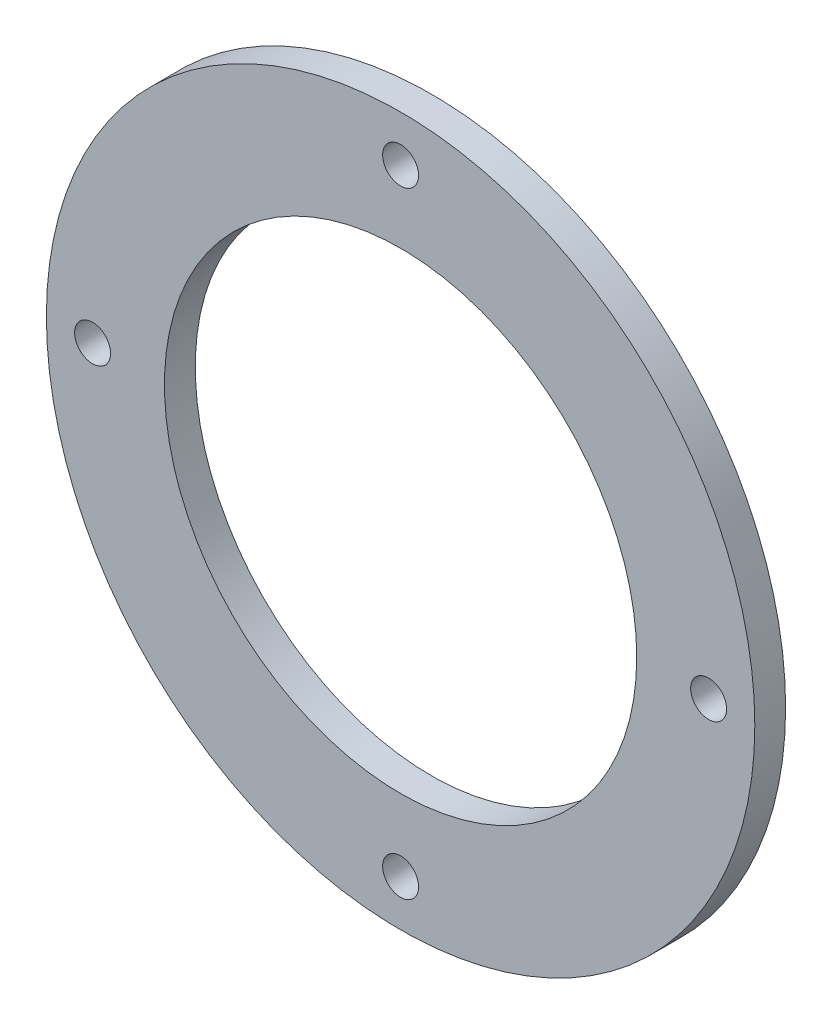
ISO-10303-21;
HEADER;
FILE_DESCRIPTION(('STEP AP214'),'2;1');
FILE_NAME('part.step','',(''),(''),'','','');
FILE_SCHEMA(('AUTOMOTIVE_DESIGN { 1 0 10303 214 1 1 1 1 }'));
ENDSEC;
DATA;
#1=APPLICATION_CONTEXT('core data for automotive mechanical design processes');
#2=APPLICATION_PROTOCOL_DEFINITION('international standard','automotive_design',2000,#1);
#3=PRODUCT_CONTEXT('',#1,'mechanical');
#4=PRODUCT('Part','Part','',(#3));
#5=PRODUCT_RELATED_PRODUCT_CATEGORY('part','',(#4));
#6=PRODUCT_DEFINITION_FORMATION('','',#4);
#7=PRODUCT_DEFINITION_CONTEXT('part definition',#1,'design');
#8=PRODUCT_DEFINITION('design','',#6,#7);
#9=PRODUCT_DEFINITION_SHAPE('','',#8);
#10=(LENGTH_UNIT() NAMED_UNIT(*) SI_UNIT(.MILLI.,.METRE.));
#11=(NAMED_UNIT(*) PLANE_ANGLE_UNIT() SI_UNIT($,.RADIAN.));
#12=(NAMED_UNIT(*) SI_UNIT($,.STERADIAN.) SOLID_ANGLE_UNIT());
#13=UNCERTAINTY_MEASURE_WITH_UNIT(LENGTH_MEASURE(1.E-05),#10,'distance_accuracy_value','');
#14=(GEOMETRIC_REPRESENTATION_CONTEXT(3) GLOBAL_UNCERTAINTY_ASSIGNED_CONTEXT((#13)) GLOBAL_UNIT_ASSIGNED_CONTEXT((#10,
#11,#12)) REPRESENTATION_CONTEXT('',''));
#15=CARTESIAN_POINT('',(0.,0.,0.));
#16=DIRECTION('',(0.,0.,1.));
#17=DIRECTION('',(1.,0.,0.));
#18=AXIS2_PLACEMENT_3D('',#15,#16,#17);
#19=CARTESIAN_POINT('',(0.,0.,3.));
#20=DIRECTION('',(0.,0.,1.));
#21=DIRECTION('',(1.,0.,0.));
#22=AXIS2_PLACEMENT_3D('',#19,#20,#21);
#23=PLANE('',#22);
#24=CARTESIAN_POINT('',(0.,-30.,3.));
#25=DIRECTION('',(0.,0.,1.));
#26=DIRECTION('',(1.,0.,0.));
#27=AXIS2_PLACEMENT_3D('',#24,#25,#26);
#28=CIRCLE('',#27,1.75);
#29=CARTESIAN_POINT('',(1.75,-30.,3.));
#30=VERTEX_POINT('',#29);
#31=EDGE_CURVE('E78',#30,#30,#28,.T.);
#32=ORIENTED_EDGE('',*,*,#31,.F.);
#33=EDGE_LOOP('',(#32));
#34=FACE_BOUND('',#33,.T.);
#35=CARTESIAN_POINT('',(0.,30.,3.));
#36=DIRECTION('',(0.,0.,1.));
#37=DIRECTION('',(1.,0.,0.));
#38=AXIS2_PLACEMENT_3D('',#35,#36,#37);
#39=CIRCLE('',#38,1.75);
#40=CARTESIAN_POINT('',(1.75,30.,3.));
#41=VERTEX_POINT('',#40);
#42=EDGE_CURVE('E62',#41,#41,#39,.T.);
#43=ORIENTED_EDGE('',*,*,#42,.F.);
#44=EDGE_LOOP('',(#43));
#45=FACE_BOUND('',#44,.T.);
#46=CARTESIAN_POINT('',(0.,0.,3.));
#47=DIRECTION('',(0.,0.,1.));
#48=DIRECTION('',(1.,0.,0.));
#49=AXIS2_PLACEMENT_3D('',#46,#47,#48);
#50=CIRCLE('',#49,34.5);
#51=CARTESIAN_POINT('',(34.5,0.,3.));
#52=VERTEX_POINT('',#51);
#53=EDGE_CURVE('E10',#52,#52,#50,.T.);
#54=ORIENTED_EDGE('',*,*,#53,.T.);
#55=EDGE_LOOP('',(#54));
#56=FACE_BOUND('',#55,.T.);
#57=CARTESIAN_POINT('',(0.,0.,3.));
#58=DIRECTION('',(0.,0.,1.));
#59=DIRECTION('',(1.,0.,0.));
#60=AXIS2_PLACEMENT_3D('',#57,#58,#59);
#61=CIRCLE('',#60,23.);
#62=CARTESIAN_POINT('',(23.,0.,3.));
#63=VERTEX_POINT('',#62);
#64=EDGE_CURVE('E56',#63,#63,#61,.T.);
#65=ORIENTED_EDGE('',*,*,#64,.F.);
#66=EDGE_LOOP('',(#65));
#67=FACE_BOUND('',#66,.T.);
#68=CARTESIAN_POINT('',(30.,0.,3.));
#69=DIRECTION('',(0.,0.,1.));
#70=DIRECTION('',(1.,0.,0.));
#71=AXIS2_PLACEMENT_3D('',#68,#69,#70);
#72=CIRCLE('',#71,1.75);
#73=CARTESIAN_POINT('',(31.75,0.,3.));
#74=VERTEX_POINT('',#73);
#75=EDGE_CURVE('E70',#74,#74,#72,.T.);
#76=ORIENTED_EDGE('',*,*,#75,.F.);
#77=EDGE_LOOP('',(#76));
#78=FACE_BOUND('',#77,.T.);
#79=CARTESIAN_POINT('',(-30.,0.,3.));
#80=DIRECTION('',(0.,0.,1.));
#81=DIRECTION('',(1.,0.,0.));
#82=AXIS2_PLACEMENT_3D('',#79,#80,#81);
#83=CIRCLE('',#82,1.75);
#84=CARTESIAN_POINT('',(-28.25,0.,3.));
#85=VERTEX_POINT('',#84);
#86=EDGE_CURVE('E86',#85,#85,#83,.T.);
#87=ORIENTED_EDGE('',*,*,#86,.F.);
#88=EDGE_LOOP('',(#87));
#89=FACE_BOUND('',#88,.T.);
#90=ADVANCED_FACE('F43',(#34,#45,#56,#67,#78,#89),#23,.T.);
#91=CARTESIAN_POINT('',(0.,0.,0.));
#92=DIRECTION('',(0.,0.,1.));
#93=DIRECTION('',(1.,0.,0.));
#94=AXIS2_PLACEMENT_3D('',#91,#92,#93);
#95=PLANE('',#94);
#96=CARTESIAN_POINT('',(0.,0.,0.));
#97=DIRECTION('',(0.,0.,1.));
#98=DIRECTION('',(1.,0.,0.));
#99=AXIS2_PLACEMENT_3D('',#96,#97,#98);
#100=CIRCLE('',#99,34.5);
#101=CARTESIAN_POINT('',(34.5,0.,0.));
#102=VERTEX_POINT('',#101);
#103=EDGE_CURVE('E47',#102,#102,#100,.T.);
#104=ORIENTED_EDGE('',*,*,#103,.F.);
#105=EDGE_LOOP('',(#104));
#106=FACE_BOUND('',#105,.T.);
#107=CARTESIAN_POINT('',(0.,0.,0.));
#108=DIRECTION('',(0.,0.,1.));
#109=DIRECTION('',(1.,0.,0.));
#110=AXIS2_PLACEMENT_3D('',#107,#108,#109);
#111=CIRCLE('',#110,23.);
#112=CARTESIAN_POINT('',(23.,0.,0.));
#113=VERTEX_POINT('',#112);
#114=EDGE_CURVE('E58',#113,#113,#111,.T.);
#115=ORIENTED_EDGE('',*,*,#114,.T.);
#116=EDGE_LOOP('',(#115));
#117=FACE_BOUND('',#116,.T.);
#118=CARTESIAN_POINT('',(0.,30.,0.));
#119=DIRECTION('',(0.,0.,1.));
#120=DIRECTION('',(1.,0.,0.));
#121=AXIS2_PLACEMENT_3D('',#118,#119,#120);
#122=CIRCLE('',#121,1.75);
#123=CARTESIAN_POINT('',(1.75,30.,0.));
#124=VERTEX_POINT('',#123);
#125=EDGE_CURVE('E66',#124,#124,#122,.T.);
#126=ORIENTED_EDGE('',*,*,#125,.T.);
#127=EDGE_LOOP('',(#126));
#128=FACE_BOUND('',#127,.T.);
#129=CARTESIAN_POINT('',(30.,0.,0.));
#130=DIRECTION('',(0.,0.,1.));
#131=DIRECTION('',(1.,0.,0.));
#132=AXIS2_PLACEMENT_3D('',#129,#130,#131);
#133=CIRCLE('',#132,1.75);
#134=CARTESIAN_POINT('',(31.75,0.,0.));
#135=VERTEX_POINT('',#134);
#136=EDGE_CURVE('E74',#135,#135,#133,.T.);
#137=ORIENTED_EDGE('',*,*,#136,.T.);
#138=EDGE_LOOP('',(#137));
#139=FACE_BOUND('',#138,.T.);
#140=CARTESIAN_POINT('',(0.,-30.,0.));
#141=DIRECTION('',(0.,0.,1.));
#142=DIRECTION('',(1.,0.,0.));
#143=AXIS2_PLACEMENT_3D('',#140,#141,#142);
#144=CIRCLE('',#143,1.75);
#145=CARTESIAN_POINT('',(1.75,-30.,0.));
#146=VERTEX_POINT('',#145);
#147=EDGE_CURVE('E82',#146,#146,#144,.T.);
#148=ORIENTED_EDGE('',*,*,#147,.T.);
#149=EDGE_LOOP('',(#148));
#150=FACE_BOUND('',#149,.T.);
#151=CARTESIAN_POINT('',(-30.,0.,0.));
#152=DIRECTION('',(0.,0.,1.));
#153=DIRECTION('',(1.,0.,0.));
#154=AXIS2_PLACEMENT_3D('',#151,#152,#153);
#155=CIRCLE('',#154,1.75);
#156=CARTESIAN_POINT('',(-28.25,0.,0.));
#157=VERTEX_POINT('',#156);
#158=EDGE_CURVE('E90',#157,#157,#155,.T.);
#159=ORIENTED_EDGE('',*,*,#158,.T.);
#160=EDGE_LOOP('',(#159));
#161=FACE_BOUND('',#160,.T.);
#162=ADVANCED_FACE('F102',(#106,#117,#128,#139,#150,#161),#95,.F.);
#163=CARTESIAN_POINT('',(0.,0.,3.));
#164=DIRECTION('',(0.,0.,-1.));
#165=DIRECTION('',(-1.,0.,0.));
#166=AXIS2_PLACEMENT_3D('',#163,#164,#165);
#167=CYLINDRICAL_SURFACE('',#166,34.5);
#168=ORIENTED_EDGE('',*,*,#53,.F.);
#169=EDGE_LOOP('',(#168));
#170=FACE_BOUND('',#169,.T.);
#171=ORIENTED_EDGE('',*,*,#103,.T.);
#172=EDGE_LOOP('',(#171));
#173=FACE_BOUND('',#172,.T.);
#174=ADVANCED_FACE('F45',(#170,#173),#167,.T.);
#175=CARTESIAN_POINT('',(0.,0.,3.));
#176=DIRECTION('',(0.,0.,-1.));
#177=DIRECTION('',(-1.,0.,0.));
#178=AXIS2_PLACEMENT_3D('',#175,#176,#177);
#179=CYLINDRICAL_SURFACE('',#178,23.);
#180=ORIENTED_EDGE('',*,*,#64,.T.);
#181=EDGE_LOOP('',(#180));
#182=FACE_BOUND('',#181,.T.);
#183=ORIENTED_EDGE('',*,*,#114,.F.);
#184=EDGE_LOOP('',(#183));
#185=FACE_BOUND('',#184,.T.);
#186=ADVANCED_FACE('F112',(#182,#185),#179,.F.);
#187=CARTESIAN_POINT('',(0.,30.,3.));
#188=DIRECTION('',(0.,0.,-1.));
#189=DIRECTION('',(-1.,0.,0.));
#190=AXIS2_PLACEMENT_3D('',#187,#188,#189);
#191=CYLINDRICAL_SURFACE('',#190,1.75);
#192=ORIENTED_EDGE('',*,*,#42,.T.);
#193=EDGE_LOOP('',(#192));
#194=FACE_BOUND('',#193,.T.);
#195=ORIENTED_EDGE('',*,*,#125,.F.);
#196=EDGE_LOOP('',(#195));
#197=FACE_BOUND('',#196,.T.);
#198=ADVANCED_FACE('F115',(#194,#197),#191,.F.);
#199=CARTESIAN_POINT('',(30.,0.,3.));
#200=DIRECTION('',(0.,0.,-1.));
#201=DIRECTION('',(-1.,0.,0.));
#202=AXIS2_PLACEMENT_3D('',#199,#200,#201);
#203=CYLINDRICAL_SURFACE('',#202,1.75);
#204=ORIENTED_EDGE('',*,*,#75,.T.);
#205=EDGE_LOOP('',(#204));
#206=FACE_BOUND('',#205,.T.);
#207=ORIENTED_EDGE('',*,*,#136,.F.);
#208=EDGE_LOOP('',(#207));
#209=FACE_BOUND('',#208,.T.);
#210=ADVANCED_FACE('F119',(#206,#209),#203,.F.);
#211=CARTESIAN_POINT('',(0.,-30.,3.));
#212=DIRECTION('',(0.,0.,-1.));
#213=DIRECTION('',(-1.,0.,0.));
#214=AXIS2_PLACEMENT_3D('',#211,#212,#213);
#215=CYLINDRICAL_SURFACE('',#214,1.75);
#216=ORIENTED_EDGE('',*,*,#31,.T.);
#217=EDGE_LOOP('',(#216));
#218=FACE_BOUND('',#217,.T.);
#219=ORIENTED_EDGE('',*,*,#147,.F.);
#220=EDGE_LOOP('',(#219));
#221=FACE_BOUND('',#220,.T.);
#222=ADVANCED_FACE('F123',(#218,#221),#215,.F.);
#223=CARTESIAN_POINT('',(-30.,0.,3.));
#224=DIRECTION('',(0.,0.,-1.));
#225=DIRECTION('',(-1.,0.,0.));
#226=AXIS2_PLACEMENT_3D('',#223,#224,#225);
#227=CYLINDRICAL_SURFACE('',#226,1.75);
#228=ORIENTED_EDGE('',*,*,#86,.T.);
#229=EDGE_LOOP('',(#228));
#230=FACE_BOUND('',#229,.T.);
#231=ORIENTED_EDGE('',*,*,#158,.F.);
#232=EDGE_LOOP('',(#231));
#233=FACE_BOUND('',#232,.T.);
#234=ADVANCED_FACE('F98',(#230,#233),#227,.F.);
#235=CLOSED_SHELL('',(#90,#162,#174,#186,#198,#210,#222,#234));
#236=MANIFOLD_SOLID_BREP('B2',#235);
#237=ADVANCED_BREP_SHAPE_REPRESENTATION('',(#18,#236),#14);
#238=SHAPE_DEFINITION_REPRESENTATION(#9,#237);
ENDSEC;
END-ISO-10303-21;
